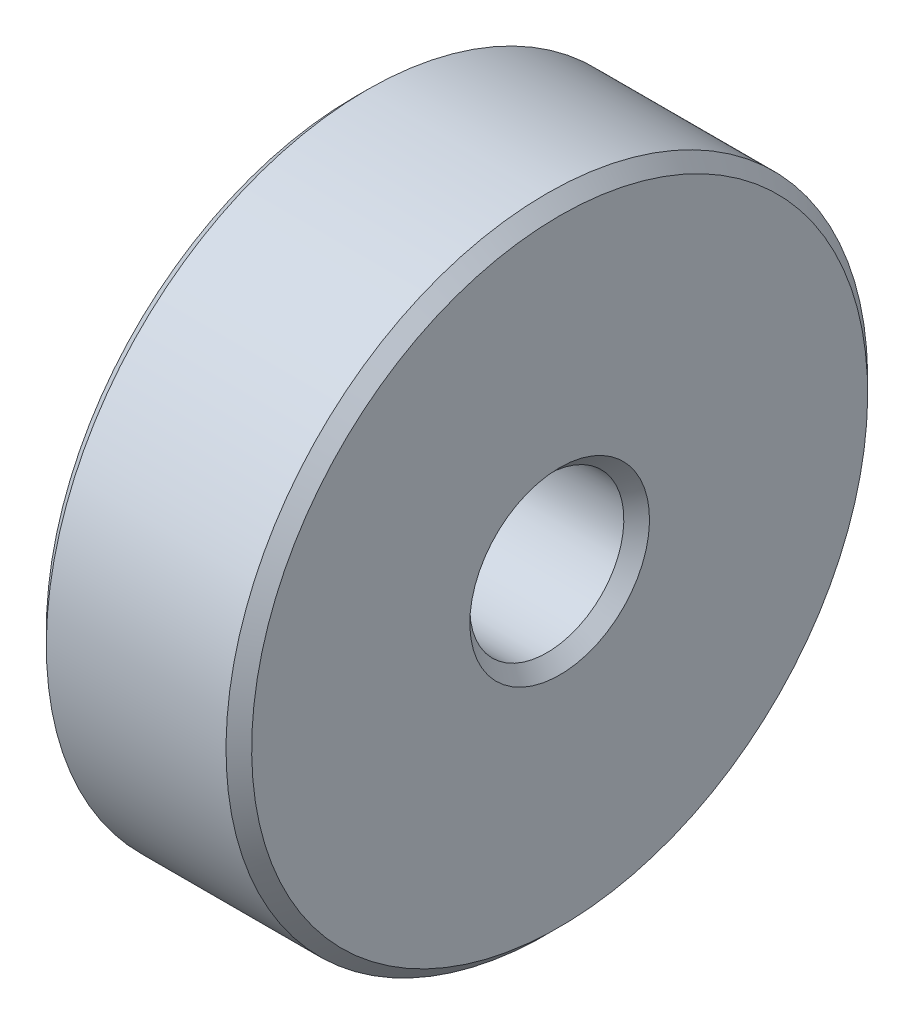
ISO-10303-21;
HEADER;
FILE_DESCRIPTION(('STEP AP214'),'2;1');
FILE_NAME('part.step','',(''),(''),'','','');
FILE_SCHEMA(('AUTOMOTIVE_DESIGN { 1 0 10303 214 1 1 1 1 }'));
ENDSEC;
DATA;
#1=APPLICATION_CONTEXT('core data for automotive mechanical design processes');
#2=APPLICATION_PROTOCOL_DEFINITION('international standard','automotive_design',2000,#1);
#3=PRODUCT_CONTEXT('',#1,'mechanical');
#4=PRODUCT('Part','Part','',(#3));
#5=PRODUCT_RELATED_PRODUCT_CATEGORY('part','',(#4));
#6=PRODUCT_DEFINITION_FORMATION('','',#4);
#7=PRODUCT_DEFINITION_CONTEXT('part definition',#1,'design');
#8=PRODUCT_DEFINITION('design','',#6,#7);
#9=PRODUCT_DEFINITION_SHAPE('','',#8);
#10=(LENGTH_UNIT() NAMED_UNIT(*) SI_UNIT(.MILLI.,.METRE.));
#11=(NAMED_UNIT(*) PLANE_ANGLE_UNIT() SI_UNIT($,.RADIAN.));
#12=(NAMED_UNIT(*) SI_UNIT($,.STERADIAN.) SOLID_ANGLE_UNIT());
#13=UNCERTAINTY_MEASURE_WITH_UNIT(LENGTH_MEASURE(1.E-05),#10,'distance_accuracy_value','');
#14=(GEOMETRIC_REPRESENTATION_CONTEXT(3) GLOBAL_UNCERTAINTY_ASSIGNED_CONTEXT((#13)) GLOBAL_UNIT_ASSIGNED_CONTEXT((#10,
#11,#12)) REPRESENTATION_CONTEXT('',''));
#15=CARTESIAN_POINT('',(0.,0.,0.));
#16=DIRECTION('',(0.,0.,1.));
#17=DIRECTION('',(1.,0.,0.));
#18=AXIS2_PLACEMENT_3D('',#15,#16,#17);
#19=CARTESIAN_POINT('',(0.5,0.,0.));
#20=DIRECTION('',(-1.,0.,0.));
#21=DIRECTION('',(0.,-1.,0.));
#22=AXIS2_PLACEMENT_3D('',#19,#20,#21);
#23=CONICAL_SURFACE('',#22,3.,0.785398163397449);
#24=CARTESIAN_POINT('',(0.,0.,0.));
#25=DIRECTION('',(1.,0.,0.));
#26=DIRECTION('',(0.,1.,0.));
#27=AXIS2_PLACEMENT_3D('',#24,#25,#26);
#28=CIRCLE('',#27,3.5);
#29=CARTESIAN_POINT('',(0.,3.5,0.));
#30=VERTEX_POINT('',#29);
#31=EDGE_CURVE('E10',#30,#30,#28,.T.);
#32=ORIENTED_EDGE('',*,*,#31,.F.);
#33=EDGE_LOOP('',(#32));
#34=FACE_BOUND('',#33,.T.);
#35=CARTESIAN_POINT('',(0.5,0.,0.));
#36=DIRECTION('',(1.,0.,0.));
#37=DIRECTION('',(0.,1.,0.));
#38=AXIS2_PLACEMENT_3D('',#35,#36,#37);
#39=CIRCLE('',#38,3.);
#40=CARTESIAN_POINT('',(0.5,3.,0.));
#41=VERTEX_POINT('',#40);
#42=EDGE_CURVE('E59',#41,#41,#39,.T.);
#43=ORIENTED_EDGE('',*,*,#42,.T.);
#44=EDGE_LOOP('',(#43));
#45=FACE_BOUND('',#44,.T.);
#46=ADVANCED_FACE('F31',(#34,#45),#23,.F.);
#47=CARTESIAN_POINT('',(0.,-3.5,0.));
#48=DIRECTION('',(1.,0.,0.));
#49=DIRECTION('',(0.,1.,0.));
#50=AXIS2_PLACEMENT_3D('',#47,#48,#49);
#51=PLANE('',#50);
#52=CARTESIAN_POINT('',(0.,0.,0.));
#53=DIRECTION('',(1.,0.,0.));
#54=DIRECTION('',(0.,1.,0.));
#55=AXIS2_PLACEMENT_3D('',#52,#53,#54);
#56=CIRCLE('',#55,12.);
#57=CARTESIAN_POINT('',(0.,12.,0.));
#58=VERTEX_POINT('',#57);
#59=EDGE_CURVE('E37',#58,#58,#56,.T.);
#60=ORIENTED_EDGE('',*,*,#59,.F.);
#61=EDGE_LOOP('',(#60));
#62=FACE_BOUND('',#61,.T.);
#63=ORIENTED_EDGE('',*,*,#31,.T.);
#64=EDGE_LOOP('',(#63));
#65=FACE_BOUND('',#64,.T.);
#66=ADVANCED_FACE('F96',(#62,#65),#51,.F.);
#67=CARTESIAN_POINT('',(0.,0.,0.));
#68=DIRECTION('',(1.,0.,0.));
#69=DIRECTION('',(0.,1.,0.));
#70=AXIS2_PLACEMENT_3D('',#67,#68,#69);
#71=CONICAL_SURFACE('',#70,12.,0.78539816339745);
#72=CARTESIAN_POINT('',(0.499999999999999,0.,0.));
#73=DIRECTION('',(1.,0.,0.));
#74=DIRECTION('',(0.,1.,0.));
#75=AXIS2_PLACEMENT_3D('',#72,#73,#74);
#76=CIRCLE('',#75,12.5);
#77=CARTESIAN_POINT('',(0.499999999999998,12.5,0.));
#78=VERTEX_POINT('',#77);
#79=EDGE_CURVE('E41',#78,#78,#76,.T.);
#80=ORIENTED_EDGE('',*,*,#79,.F.);
#81=EDGE_LOOP('',(#80));
#82=FACE_BOUND('',#81,.T.);
#83=ORIENTED_EDGE('',*,*,#59,.T.);
#84=EDGE_LOOP('',(#83));
#85=FACE_BOUND('',#84,.T.);
#86=ADVANCED_FACE('F91',(#82,#85),#71,.T.);
#87=CARTESIAN_POINT('',(-3.,0.,0.));
#88=DIRECTION('',(1.,0.,0.));
#89=DIRECTION('',(0.,1.,0.));
#90=AXIS2_PLACEMENT_3D('',#87,#88,#89);
#91=CYLINDRICAL_SURFACE('',#90,12.5);
#92=CARTESIAN_POINT('',(7.5,0.,0.));
#93=DIRECTION('',(1.,0.,0.));
#94=DIRECTION('',(0.,1.,0.));
#95=AXIS2_PLACEMENT_3D('',#92,#93,#94);
#96=CIRCLE('',#95,12.5);
#97=CARTESIAN_POINT('',(7.5,12.5,0.));
#98=VERTEX_POINT('',#97);
#99=EDGE_CURVE('E45',#98,#98,#96,.T.);
#100=ORIENTED_EDGE('',*,*,#99,.F.);
#101=EDGE_LOOP('',(#100));
#102=FACE_BOUND('',#101,.T.);
#103=ORIENTED_EDGE('',*,*,#79,.T.);
#104=EDGE_LOOP('',(#103));
#105=FACE_BOUND('',#104,.T.);
#106=ADVANCED_FACE('F85',(#102,#105),#91,.T.);
#107=CARTESIAN_POINT('',(7.5,0.,0.));
#108=DIRECTION('',(-1.,0.,0.));
#109=DIRECTION('',(0.,-1.,0.));
#110=AXIS2_PLACEMENT_3D('',#107,#108,#109);
#111=CONICAL_SURFACE('',#110,12.5,0.785398163397447);
#112=CARTESIAN_POINT('',(8.,0.,0.));
#113=DIRECTION('',(1.,0.,0.));
#114=DIRECTION('',(0.,1.,0.));
#115=AXIS2_PLACEMENT_3D('',#112,#113,#114);
#116=CIRCLE('',#115,12.);
#117=CARTESIAN_POINT('',(8.,12.,0.));
#118=VERTEX_POINT('',#117);
#119=EDGE_CURVE('E50',#118,#118,#116,.T.);
#120=ORIENTED_EDGE('',*,*,#119,.F.);
#121=EDGE_LOOP('',(#120));
#122=FACE_BOUND('',#121,.T.);
#123=ORIENTED_EDGE('',*,*,#99,.T.);
#124=EDGE_LOOP('',(#123));
#125=FACE_BOUND('',#124,.T.);
#126=ADVANCED_FACE('F79',(#122,#125),#111,.T.);
#127=CARTESIAN_POINT('',(8.,-12.,0.));
#128=DIRECTION('',(-1.,0.,0.));
#129=DIRECTION('',(0.,-1.,0.));
#130=AXIS2_PLACEMENT_3D('',#127,#128,#129);
#131=PLANE('',#130);
#132=CARTESIAN_POINT('',(8.,0.,0.));
#133=DIRECTION('',(1.,0.,0.));
#134=DIRECTION('',(0.,1.,0.));
#135=AXIS2_PLACEMENT_3D('',#132,#133,#134);
#136=CIRCLE('',#135,3.5);
#137=CARTESIAN_POINT('',(8.,3.5,0.));
#138=VERTEX_POINT('',#137);
#139=EDGE_CURVE('E53',#138,#138,#136,.T.);
#140=ORIENTED_EDGE('',*,*,#139,.F.);
#141=EDGE_LOOP('',(#140));
#142=FACE_BOUND('',#141,.T.);
#143=ORIENTED_EDGE('',*,*,#119,.T.);
#144=EDGE_LOOP('',(#143));
#145=FACE_BOUND('',#144,.T.);
#146=ADVANCED_FACE('F73',(#142,#145),#131,.F.);
#147=CARTESIAN_POINT('',(8.,0.,0.));
#148=DIRECTION('',(1.,0.,0.));
#149=DIRECTION('',(0.,1.,0.));
#150=AXIS2_PLACEMENT_3D('',#147,#148,#149);
#151=CONICAL_SURFACE('',#150,3.5,0.785398163397447);
#152=CARTESIAN_POINT('',(7.5,0.,0.));
#153=DIRECTION('',(1.,0.,0.));
#154=DIRECTION('',(0.,1.,0.));
#155=AXIS2_PLACEMENT_3D('',#152,#153,#154);
#156=CIRCLE('',#155,3.);
#157=CARTESIAN_POINT('',(7.5,3.,0.));
#158=VERTEX_POINT('',#157);
#159=EDGE_CURVE('E56',#158,#158,#156,.T.);
#160=ORIENTED_EDGE('',*,*,#159,.F.);
#161=EDGE_LOOP('',(#160));
#162=FACE_BOUND('',#161,.T.);
#163=ORIENTED_EDGE('',*,*,#139,.T.);
#164=EDGE_LOOP('',(#163));
#165=FACE_BOUND('',#164,.T.);
#166=ADVANCED_FACE('F67',(#162,#165),#151,.F.);
#167=CARTESIAN_POINT('',(-3.,0.,0.));
#168=DIRECTION('',(1.,0.,0.));
#169=DIRECTION('',(0.,1.,0.));
#170=AXIS2_PLACEMENT_3D('',#167,#168,#169);
#171=CYLINDRICAL_SURFACE('',#170,3.);
#172=ORIENTED_EDGE('',*,*,#42,.F.);
#173=EDGE_LOOP('',(#172));
#174=FACE_BOUND('',#173,.T.);
#175=ORIENTED_EDGE('',*,*,#159,.T.);
#176=EDGE_LOOP('',(#175));
#177=FACE_BOUND('',#176,.T.);
#178=ADVANCED_FACE('F64',(#174,#177),#171,.F.);
#179=CLOSED_SHELL('',(#46,#66,#86,#106,#126,#146,#166,#178));
#180=MANIFOLD_SOLID_BREP('B2',#179);
#181=ADVANCED_BREP_SHAPE_REPRESENTATION('',(#18,#180),#14);
#182=SHAPE_DEFINITION_REPRESENTATION(#9,#181);
ENDSEC;
END-ISO-10303-21;
